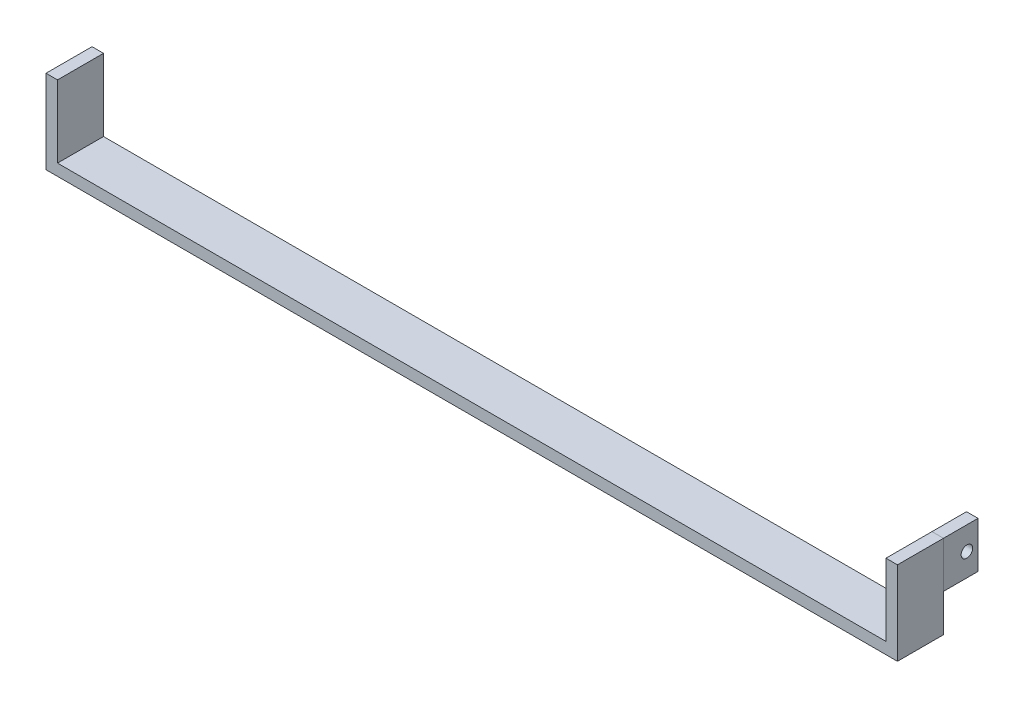
ISO-10303-21;
HEADER;
FILE_DESCRIPTION(('STEP AP214'),'2;1');
FILE_NAME('part.step','',(''),(''),'','','');
FILE_SCHEMA(('AUTOMOTIVE_DESIGN { 1 0 10303 214 1 1 1 1 }'));
ENDSEC;
DATA;
#1=APPLICATION_CONTEXT('core data for automotive mechanical design processes');
#2=APPLICATION_PROTOCOL_DEFINITION('international standard','automotive_design',2000,#1);
#3=PRODUCT_CONTEXT('',#1,'mechanical');
#4=PRODUCT('Part','Part','',(#3));
#5=PRODUCT_RELATED_PRODUCT_CATEGORY('part','',(#4));
#6=PRODUCT_DEFINITION_FORMATION('','',#4);
#7=PRODUCT_DEFINITION_CONTEXT('part definition',#1,'design');
#8=PRODUCT_DEFINITION('design','',#6,#7);
#9=PRODUCT_DEFINITION_SHAPE('','',#8);
#10=(LENGTH_UNIT() NAMED_UNIT(*) SI_UNIT(.MILLI.,.METRE.));
#11=(NAMED_UNIT(*) PLANE_ANGLE_UNIT() SI_UNIT($,.RADIAN.));
#12=(NAMED_UNIT(*) SI_UNIT($,.STERADIAN.) SOLID_ANGLE_UNIT());
#13=UNCERTAINTY_MEASURE_WITH_UNIT(LENGTH_MEASURE(1.E-05),#10,'distance_accuracy_value','');
#14=(GEOMETRIC_REPRESENTATION_CONTEXT(3) GLOBAL_UNCERTAINTY_ASSIGNED_CONTEXT((#13)) GLOBAL_UNIT_ASSIGNED_CONTEXT((#10,
#11,#12)) REPRESENTATION_CONTEXT('',''));
#15=CARTESIAN_POINT('',(0.,0.,0.));
#16=DIRECTION('',(0.,0.,1.));
#17=DIRECTION('',(1.,0.,0.));
#18=AXIS2_PLACEMENT_3D('',#15,#16,#17);
#19=CARTESIAN_POINT('',(370.,36.32,-35.));
#20=DIRECTION('',(-1.,0.,0.));
#21=DIRECTION('',(0.,0.,1.));
#22=AXIS2_PLACEMENT_3D('',#19,#20,#21);
#23=PLANE('',#22);
#24=CARTESIAN_POINT('',(370.,26.24,-30.17));
#25=DIRECTION('',(1.,0.,0.));
#26=DIRECTION('',(0.,0.,-1.));
#27=AXIS2_PLACEMENT_3D('',#24,#25,#26);
#28=CIRCLE('',#27,2.49999999999999);
#29=CARTESIAN_POINT('',(370.,26.24,-32.67));
#30=VERTEX_POINT('',#29);
#31=EDGE_CURVE('E127',#30,#30,#28,.T.);
#32=ORIENTED_EDGE('',*,*,#31,.F.);
#33=EDGE_LOOP('',(#32));
#34=FACE_BOUND('',#33,.T.);
#35=DIRECTION('',(0.,-1.,0.));
#36=VECTOR('',#35,1.);
#37=CARTESIAN_POINT('',(370.,36.32,-20.));
#38=LINE('',#37,#36);
#39=CARTESIAN_POINT('',(370.,36.32,-20.));
#40=VERTEX_POINT('',#39);
#41=CARTESIAN_POINT('',(370.,16.32,-20.));
#42=VERTEX_POINT('',#41);
#43=EDGE_CURVE('E114',#40,#42,#38,.T.);
#44=ORIENTED_EDGE('',*,*,#43,.T.);
#45=DIRECTION('',(0.,0.,1.));
#46=VECTOR('',#45,1.);
#47=CARTESIAN_POINT('',(370.,16.32,-35.));
#48=LINE('',#47,#46);
#49=CARTESIAN_POINT('',(370.,16.32,-35.));
#50=VERTEX_POINT('',#49);
#51=EDGE_CURVE('E12',#50,#42,#48,.T.);
#52=ORIENTED_EDGE('',*,*,#51,.F.);
#53=DIRECTION('',(0.,-1.,0.));
#54=VECTOR('',#53,1.);
#55=CARTESIAN_POINT('',(370.,36.32,-35.));
#56=LINE('',#55,#54);
#57=CARTESIAN_POINT('',(370.,36.32,-35.));
#58=VERTEX_POINT('',#57);
#59=EDGE_CURVE('E101',#58,#50,#56,.T.);
#60=ORIENTED_EDGE('',*,*,#59,.F.);
#61=DIRECTION('',(0.,0.,1.));
#62=VECTOR('',#61,1.);
#63=CARTESIAN_POINT('',(370.,36.32,-35.));
#64=LINE('',#63,#62);
#65=EDGE_CURVE('E110',#58,#40,#64,.T.);
#66=ORIENTED_EDGE('',*,*,#65,.T.);
#67=EDGE_LOOP('',(#44,#52,#60,#66));
#68=FACE_BOUND('',#67,.T.);
#69=ADVANCED_FACE('F49',(#34,#68),#23,.F.);
#70=CARTESIAN_POINT('',(370.,16.32,-35.));
#71=DIRECTION('',(0.,1.,0.));
#72=DIRECTION('',(0.,0.,1.));
#73=AXIS2_PLACEMENT_3D('',#70,#71,#72);
#74=PLANE('',#73);
#75=DIRECTION('',(-1.,0.,0.));
#76=VECTOR('',#75,1.);
#77=CARTESIAN_POINT('',(370.,16.32,-20.));
#78=LINE('',#77,#76);
#79=CARTESIAN_POINT('',(365.,16.32,-20.));
#80=VERTEX_POINT('',#79);
#81=EDGE_CURVE('E105',#42,#80,#78,.T.);
#82=ORIENTED_EDGE('',*,*,#81,.T.);
#83=DIRECTION('',(0.,0.,1.));
#84=VECTOR('',#83,1.);
#85=CARTESIAN_POINT('',(365.,16.32,-35.));
#86=LINE('',#85,#84);
#87=CARTESIAN_POINT('',(365.,16.32,-35.));
#88=VERTEX_POINT('',#87);
#89=EDGE_CURVE('E58',#88,#80,#86,.T.);
#90=ORIENTED_EDGE('',*,*,#89,.F.);
#91=DIRECTION('',(-1.,0.,0.));
#92=VECTOR('',#91,1.);
#93=CARTESIAN_POINT('',(370.,16.32,-35.));
#94=LINE('',#93,#92);
#95=EDGE_CURVE('E96',#50,#88,#94,.T.);
#96=ORIENTED_EDGE('',*,*,#95,.F.);
#97=ORIENTED_EDGE('',*,*,#51,.T.);
#98=EDGE_LOOP('',(#82,#90,#96,#97));
#99=FACE_BOUND('',#98,.T.);
#100=ADVANCED_FACE('F104',(#99),#74,.F.);
#101=CARTESIAN_POINT('',(365.,36.32,-35.));
#102=DIRECTION('',(1.,0.,0.));
#103=DIRECTION('',(0.,0.,-1.));
#104=AXIS2_PLACEMENT_3D('',#101,#102,#103);
#105=PLANE('',#104);
#106=CARTESIAN_POINT('',(365.,26.24,-30.17));
#107=DIRECTION('',(1.,0.,0.));
#108=DIRECTION('',(0.,0.,-1.));
#109=AXIS2_PLACEMENT_3D('',#106,#107,#108);
#110=CIRCLE('',#109,2.49999999999999);
#111=CARTESIAN_POINT('',(365.,26.24,-32.67));
#112=VERTEX_POINT('',#111);
#113=EDGE_CURVE('E52',#112,#112,#110,.T.);
#114=ORIENTED_EDGE('',*,*,#113,.T.);
#115=EDGE_LOOP('',(#114));
#116=FACE_BOUND('',#115,.T.);
#117=DIRECTION('',(0.,1.,0.));
#118=VECTOR('',#117,1.);
#119=CARTESIAN_POINT('',(365.,36.32,-20.));
#120=LINE('',#119,#118);
#121=CARTESIAN_POINT('',(365.,36.32,-20.));
#122=VERTEX_POINT('',#121);
#123=EDGE_CURVE('E83',#80,#122,#120,.T.);
#124=ORIENTED_EDGE('',*,*,#123,.T.);
#125=DIRECTION('',(0.,0.,1.));
#126=VECTOR('',#125,1.);
#127=CARTESIAN_POINT('',(365.,36.32,-35.));
#128=LINE('',#127,#126);
#129=CARTESIAN_POINT('',(365.,36.32,-35.));
#130=VERTEX_POINT('',#129);
#131=EDGE_CURVE('E106',#130,#122,#128,.T.);
#132=ORIENTED_EDGE('',*,*,#131,.F.);
#133=DIRECTION('',(0.,1.,0.));
#134=VECTOR('',#133,1.);
#135=CARTESIAN_POINT('',(365.,36.32,-35.));
#136=LINE('',#135,#134);
#137=EDGE_CURVE('E99',#88,#130,#136,.T.);
#138=ORIENTED_EDGE('',*,*,#137,.F.);
#139=ORIENTED_EDGE('',*,*,#89,.T.);
#140=EDGE_LOOP('',(#124,#132,#138,#139));
#141=FACE_BOUND('',#140,.T.);
#142=ADVANCED_FACE('F108',(#116,#141),#105,.F.);
#143=CARTESIAN_POINT('',(370.,36.32,-35.));
#144=DIRECTION('',(0.,-1.,0.));
#145=DIRECTION('',(0.,0.,-1.));
#146=AXIS2_PLACEMENT_3D('',#143,#144,#145);
#147=PLANE('',#146);
#148=DIRECTION('',(1.,0.,0.));
#149=VECTOR('',#148,1.);
#150=CARTESIAN_POINT('',(370.,36.32,-20.));
#151=LINE('',#150,#149);
#152=EDGE_CURVE('E89',#122,#40,#151,.T.);
#153=ORIENTED_EDGE('',*,*,#152,.T.);
#154=ORIENTED_EDGE('',*,*,#65,.F.);
#155=DIRECTION('',(1.,0.,0.));
#156=VECTOR('',#155,1.);
#157=CARTESIAN_POINT('',(370.,36.32,-35.));
#158=LINE('',#157,#156);
#159=EDGE_CURVE('E66',#130,#58,#158,.T.);
#160=ORIENTED_EDGE('',*,*,#159,.F.);
#161=ORIENTED_EDGE('',*,*,#131,.T.);
#162=EDGE_LOOP('',(#153,#154,#160,#161));
#163=FACE_BOUND('',#162,.T.);
#164=ADVANCED_FACE('F121',(#163),#147,.F.);
#165=CARTESIAN_POINT('',(0.,0.,-35.));
#166=DIRECTION('',(0.,0.,-1.));
#167=DIRECTION('',(-1.,0.,0.));
#168=AXIS2_PLACEMENT_3D('',#165,#166,#167);
#169=PLANE('',#168);
#170=ORIENTED_EDGE('',*,*,#59,.T.);
#171=ORIENTED_EDGE('',*,*,#95,.T.);
#172=ORIENTED_EDGE('',*,*,#137,.T.);
#173=ORIENTED_EDGE('',*,*,#159,.T.);
#174=EDGE_LOOP('',(#170,#171,#172,#173));
#175=FACE_BOUND('',#174,.T.);
#176=ADVANCED_FACE('F97',(#175),#169,.T.);
#177=CARTESIAN_POINT('',(0.,0.,-20.));
#178=DIRECTION('',(0.,0.,-1.));
#179=DIRECTION('',(-1.,0.,0.));
#180=AXIS2_PLACEMENT_3D('',#177,#178,#179);
#181=PLANE('',#180);
#182=ORIENTED_EDGE('',*,*,#43,.F.);
#183=ORIENTED_EDGE('',*,*,#152,.F.);
#184=ORIENTED_EDGE('',*,*,#123,.F.);
#185=ORIENTED_EDGE('',*,*,#81,.F.);
#186=EDGE_LOOP('',(#182,#183,#184,#185));
#187=FACE_BOUND('',#186,.T.);
#188=ADVANCED_FACE('F124',(#187),#181,.F.);
#189=CARTESIAN_POINT('',(355.,26.24,-30.17));
#190=DIRECTION('',(1.,0.,0.));
#191=DIRECTION('',(0.,0.,-1.));
#192=AXIS2_PLACEMENT_3D('',#189,#190,#191);
#193=CYLINDRICAL_SURFACE('',#192,2.49999999999999);
#194=ORIENTED_EDGE('',*,*,#31,.T.);
#195=EDGE_LOOP('',(#194));
#196=FACE_BOUND('',#195,.T.);
#197=ORIENTED_EDGE('',*,*,#113,.F.);
#198=EDGE_LOOP('',(#197));
#199=FACE_BOUND('',#198,.T.);
#200=ADVANCED_FACE('F135',(#196,#199),#193,.F.);
#201=CLOSED_SHELL('',(#69,#100,#142,#164,#176,#188,#200));
#202=MANIFOLD_SOLID_BREP('B2',#201);
#203=CARTESIAN_POINT('',(0.,5.,0.));
#204=DIRECTION('',(0.,-1.,0.));
#205=DIRECTION('',(0.,0.,-1.));
#206=AXIS2_PLACEMENT_3D('',#203,#204,#205);
#207=PLANE('',#206);
#208=DIRECTION('',(0.,0.,1.));
#209=VECTOR('',#208,1.);
#210=CARTESIAN_POINT('',(365.,5.,-20.));
#211=LINE('',#210,#209);
#212=CARTESIAN_POINT('',(365.,5.,-20.));
#213=VERTEX_POINT('',#212);
#214=CARTESIAN_POINT('',(365.,5.,0.));
#215=VERTEX_POINT('',#214);
#216=EDGE_CURVE('E276',#213,#215,#211,.T.);
#217=ORIENTED_EDGE('',*,*,#216,.F.);
#218=DIRECTION('',(-1.,0.,0.));
#219=VECTOR('',#218,1.);
#220=CARTESIAN_POINT('',(0.,5.,-20.));
#221=LINE('',#220,#219);
#222=CARTESIAN_POINT('',(5.,5.,-20.));
#223=VERTEX_POINT('',#222);
#224=EDGE_CURVE('E303',#213,#223,#221,.T.);
#225=ORIENTED_EDGE('',*,*,#224,.T.);
#226=DIRECTION('',(0.,0.,-1.));
#227=VECTOR('',#226,1.);
#228=CARTESIAN_POINT('',(5.,5.,-20.));
#229=LINE('',#228,#227);
#230=CARTESIAN_POINT('',(5.,5.,0.));
#231=VERTEX_POINT('',#230);
#232=EDGE_CURVE('E213',#231,#223,#229,.T.);
#233=ORIENTED_EDGE('',*,*,#232,.F.);
#234=DIRECTION('',(1.,0.,0.));
#235=VECTOR('',#234,1.);
#236=CARTESIAN_POINT('',(0.,5.,0.));
#237=LINE('',#236,#235);
#238=EDGE_CURVE('E208',#231,#215,#237,.T.);
#239=ORIENTED_EDGE('',*,*,#238,.T.);
#240=EDGE_LOOP('',(#217,#225,#233,#239));
#241=FACE_BOUND('',#240,.T.);
#242=ADVANCED_FACE('F193',(#241),#207,.F.);
#243=CARTESIAN_POINT('',(0.,5.,0.));
#244=DIRECTION('',(1.,0.,0.));
#245=DIRECTION('',(0.,0.,-1.));
#246=AXIS2_PLACEMENT_3D('',#243,#244,#245);
#247=PLANE('',#246);
#248=DIRECTION('',(0.,0.,1.));
#249=VECTOR('',#248,1.);
#250=CARTESIAN_POINT('',(0.,0.,0.));
#251=LINE('',#250,#249);
#252=CARTESIAN_POINT('',(0.,0.,-20.));
#253=VERTEX_POINT('',#252);
#254=CARTESIAN_POINT('',(0.,0.,0.));
#255=VERTEX_POINT('',#254);
#256=EDGE_CURVE('E301',#253,#255,#251,.T.);
#257=ORIENTED_EDGE('',*,*,#256,.T.);
#258=DIRECTION('',(0.,-1.,0.));
#259=VECTOR('',#258,1.);
#260=CARTESIAN_POINT('',(0.,5.,0.));
#261=LINE('',#260,#259);
#262=CARTESIAN_POINT('',(0.,36.32,0.));
#263=VERTEX_POINT('',#262);
#264=EDGE_CURVE('E47',#263,#255,#261,.T.);
#265=ORIENTED_EDGE('',*,*,#264,.F.);
#266=DIRECTION('',(0.,0.,1.));
#267=VECTOR('',#266,1.);
#268=CARTESIAN_POINT('',(0.,36.32,-20.));
#269=LINE('',#268,#267);
#270=CARTESIAN_POINT('',(0.,36.32,-20.));
#271=VERTEX_POINT('',#270);
#272=EDGE_CURVE('E281',#271,#263,#269,.T.);
#273=ORIENTED_EDGE('',*,*,#272,.F.);
#274=DIRECTION('',(0.,-1.,0.));
#275=VECTOR('',#274,1.);
#276=CARTESIAN_POINT('',(0.,5.,-20.));
#277=LINE('',#276,#275);
#278=EDGE_CURVE('E306',#271,#253,#277,.T.);
#279=ORIENTED_EDGE('',*,*,#278,.T.);
#280=EDGE_LOOP('',(#257,#265,#273,#279));
#281=FACE_BOUND('',#280,.T.);
#282=ADVANCED_FACE('F195',(#281),#247,.F.);
#283=CARTESIAN_POINT('',(0.,5.,0.));
#284=DIRECTION('',(0.,0.,-1.));
#285=DIRECTION('',(-1.,0.,0.));
#286=AXIS2_PLACEMENT_3D('',#283,#284,#285);
#287=PLANE('',#286);
#288=DIRECTION('',(1.,0.,0.));
#289=VECTOR('',#288,1.);
#290=CARTESIAN_POINT('',(0.,0.,0.));
#291=LINE('',#290,#289);
#292=CARTESIAN_POINT('',(370.,0.,0.));
#293=VERTEX_POINT('',#292);
#294=EDGE_CURVE('E309',#255,#293,#291,.T.);
#295=ORIENTED_EDGE('',*,*,#294,.T.);
#296=DIRECTION('',(0.,-1.,0.));
#297=VECTOR('',#296,1.);
#298=CARTESIAN_POINT('',(370.,5.,0.));
#299=LINE('',#298,#297);
#300=CARTESIAN_POINT('',(370.,36.32,0.));
#301=VERTEX_POINT('',#300);
#302=EDGE_CURVE('E201',#301,#293,#299,.T.);
#303=ORIENTED_EDGE('',*,*,#302,.F.);
#304=DIRECTION('',(1.,0.,0.));
#305=VECTOR('',#304,1.);
#306=CARTESIAN_POINT('',(365.,36.32,0.));
#307=LINE('',#306,#305);
#308=CARTESIAN_POINT('',(365.,36.32,0.));
#309=VERTEX_POINT('',#308);
#310=EDGE_CURVE('E256',#309,#301,#307,.T.);
#311=ORIENTED_EDGE('',*,*,#310,.F.);
#312=DIRECTION('',(0.,-1.,0.));
#313=VECTOR('',#312,1.);
#314=CARTESIAN_POINT('',(365.,36.32,0.));
#315=LINE('',#314,#313);
#316=EDGE_CURVE('E260',#309,#215,#315,.T.);
#317=ORIENTED_EDGE('',*,*,#316,.T.);
#318=ORIENTED_EDGE('',*,*,#238,.F.);
#319=DIRECTION('',(0.,-1.,0.));
#320=VECTOR('',#319,1.);
#321=CARTESIAN_POINT('',(5.,36.32,0.));
#322=LINE('',#321,#320);
#323=CARTESIAN_POINT('',(5.,36.32,0.));
#324=VERTEX_POINT('',#323);
#325=EDGE_CURVE('E298',#324,#231,#322,.T.);
#326=ORIENTED_EDGE('',*,*,#325,.F.);
#327=DIRECTION('',(1.,0.,0.));
#328=VECTOR('',#327,1.);
#329=CARTESIAN_POINT('',(0.,36.32,0.));
#330=LINE('',#329,#328);
#331=EDGE_CURVE('E288',#263,#324,#330,.T.);
#332=ORIENTED_EDGE('',*,*,#331,.F.);
#333=ORIENTED_EDGE('',*,*,#264,.T.);
#334=EDGE_LOOP('',(#295,#303,#311,#317,#318,#326,#332,#333));
#335=FACE_BOUND('',#334,.T.);
#336=ADVANCED_FACE('F258',(#335),#287,.F.);
#337=CARTESIAN_POINT('',(370.,5.,0.));
#338=DIRECTION('',(-1.,0.,0.));
#339=DIRECTION('',(0.,0.,1.));
#340=AXIS2_PLACEMENT_3D('',#337,#338,#339);
#341=PLANE('',#340);
#342=DIRECTION('',(0.,0.,-1.));
#343=VECTOR('',#342,1.);
#344=CARTESIAN_POINT('',(370.,0.,0.));
#345=LINE('',#344,#343);
#346=CARTESIAN_POINT('',(370.,0.,-20.));
#347=VERTEX_POINT('',#346);
#348=EDGE_CURVE('E311',#293,#347,#345,.T.);
#349=ORIENTED_EDGE('',*,*,#348,.T.);
#350=DIRECTION('',(0.,-1.,0.));
#351=VECTOR('',#350,1.);
#352=CARTESIAN_POINT('',(370.,5.,-20.));
#353=LINE('',#352,#351);
#354=CARTESIAN_POINT('',(370.,36.32,-20.));
#355=VERTEX_POINT('',#354);
#356=EDGE_CURVE('E316',#355,#347,#353,.T.);
#357=ORIENTED_EDGE('',*,*,#356,.F.);
#358=DIRECTION('',(0.,0.,-1.));
#359=VECTOR('',#358,1.);
#360=CARTESIAN_POINT('',(370.,36.32,-20.));
#361=LINE('',#360,#359);
#362=EDGE_CURVE('E266',#301,#355,#361,.T.);
#363=ORIENTED_EDGE('',*,*,#362,.F.);
#364=ORIENTED_EDGE('',*,*,#302,.T.);
#365=EDGE_LOOP('',(#349,#357,#363,#364));
#366=FACE_BOUND('',#365,.T.);
#367=ADVANCED_FACE('F320',(#366),#341,.F.);
#368=CARTESIAN_POINT('',(0.,5.,-20.));
#369=DIRECTION('',(0.,0.,1.));
#370=DIRECTION('',(1.,0.,0.));
#371=AXIS2_PLACEMENT_3D('',#368,#369,#370);
#372=PLANE('',#371);
#373=DIRECTION('',(-1.,0.,0.));
#374=VECTOR('',#373,1.);
#375=CARTESIAN_POINT('',(0.,0.,-20.));
#376=LINE('',#375,#374);
#377=EDGE_CURVE('E304',#347,#253,#376,.T.);
#378=ORIENTED_EDGE('',*,*,#377,.T.);
#379=ORIENTED_EDGE('',*,*,#278,.F.);
#380=DIRECTION('',(-1.,0.,0.));
#381=VECTOR('',#380,1.);
#382=CARTESIAN_POINT('',(0.,36.32,-20.));
#383=LINE('',#382,#381);
#384=CARTESIAN_POINT('',(5.,36.32,-20.));
#385=VERTEX_POINT('',#384);
#386=EDGE_CURVE('E292',#385,#271,#383,.T.);
#387=ORIENTED_EDGE('',*,*,#386,.F.);
#388=DIRECTION('',(0.,-1.,0.));
#389=VECTOR('',#388,1.);
#390=CARTESIAN_POINT('',(5.,36.32,-20.));
#391=LINE('',#390,#389);
#392=EDGE_CURVE('E294',#385,#223,#391,.T.);
#393=ORIENTED_EDGE('',*,*,#392,.T.);
#394=ORIENTED_EDGE('',*,*,#224,.F.);
#395=DIRECTION('',(0.,-1.,0.));
#396=VECTOR('',#395,1.);
#397=CARTESIAN_POINT('',(365.,36.32,-20.));
#398=LINE('',#397,#396);
#399=CARTESIAN_POINT('',(365.,36.32,-20.));
#400=VERTEX_POINT('',#399);
#401=EDGE_CURVE('E279',#400,#213,#398,.T.);
#402=ORIENTED_EDGE('',*,*,#401,.F.);
#403=DIRECTION('',(-1.,0.,0.));
#404=VECTOR('',#403,1.);
#405=CARTESIAN_POINT('',(365.,36.32,-20.));
#406=LINE('',#405,#404);
#407=EDGE_CURVE('E272',#355,#400,#406,.T.);
#408=ORIENTED_EDGE('',*,*,#407,.F.);
#409=ORIENTED_EDGE('',*,*,#356,.T.);
#410=EDGE_LOOP('',(#378,#379,#387,#393,#394,#402,#408,#409));
#411=FACE_BOUND('',#410,.T.);
#412=ADVANCED_FACE('F326',(#411),#372,.F.);
#413=CARTESIAN_POINT('',(0.,0.,0.));
#414=DIRECTION('',(0.,-1.,0.));
#415=DIRECTION('',(0.,0.,-1.));
#416=AXIS2_PLACEMENT_3D('',#413,#414,#415);
#417=PLANE('',#416);
#418=ORIENTED_EDGE('',*,*,#256,.F.);
#419=ORIENTED_EDGE('',*,*,#377,.F.);
#420=ORIENTED_EDGE('',*,*,#348,.F.);
#421=ORIENTED_EDGE('',*,*,#294,.F.);
#422=EDGE_LOOP('',(#418,#419,#420,#421));
#423=FACE_BOUND('',#422,.T.);
#424=ADVANCED_FACE('F324',(#423),#417,.T.);
#425=CARTESIAN_POINT('',(5.,36.32,-20.));
#426=DIRECTION('',(-1.,0.,0.));
#427=DIRECTION('',(0.,0.,1.));
#428=AXIS2_PLACEMENT_3D('',#425,#426,#427);
#429=PLANE('',#428);
#430=ORIENTED_EDGE('',*,*,#232,.T.);
#431=ORIENTED_EDGE('',*,*,#392,.F.);
#432=DIRECTION('',(0.,0.,-1.));
#433=VECTOR('',#432,1.);
#434=CARTESIAN_POINT('',(5.,36.32,-20.));
#435=LINE('',#434,#433);
#436=EDGE_CURVE('E290',#324,#385,#435,.T.);
#437=ORIENTED_EDGE('',*,*,#436,.F.);
#438=ORIENTED_EDGE('',*,*,#325,.T.);
#439=EDGE_LOOP('',(#430,#431,#437,#438));
#440=FACE_BOUND('',#439,.T.);
#441=ADVANCED_FACE('F337',(#440),#429,.F.);
#442=CARTESIAN_POINT('',(0.,36.32,0.));
#443=DIRECTION('',(0.,1.,0.));
#444=DIRECTION('',(0.,0.,1.));
#445=AXIS2_PLACEMENT_3D('',#442,#443,#444);
#446=PLANE('',#445);
#447=ORIENTED_EDGE('',*,*,#272,.T.);
#448=ORIENTED_EDGE('',*,*,#331,.T.);
#449=ORIENTED_EDGE('',*,*,#436,.T.);
#450=ORIENTED_EDGE('',*,*,#386,.T.);
#451=EDGE_LOOP('',(#447,#448,#449,#450));
#452=FACE_BOUND('',#451,.T.);
#453=ADVANCED_FACE('F332',(#452),#446,.T.);
#454=CARTESIAN_POINT('',(365.,36.32,-20.));
#455=DIRECTION('',(1.,0.,0.));
#456=DIRECTION('',(0.,0.,-1.));
#457=AXIS2_PLACEMENT_3D('',#454,#455,#456);
#458=PLANE('',#457);
#459=ORIENTED_EDGE('',*,*,#216,.T.);
#460=ORIENTED_EDGE('',*,*,#316,.F.);
#461=DIRECTION('',(0.,0.,1.));
#462=VECTOR('',#461,1.);
#463=CARTESIAN_POINT('',(365.,36.32,-20.));
#464=LINE('',#463,#462);
#465=EDGE_CURVE('E267',#400,#309,#464,.T.);
#466=ORIENTED_EDGE('',*,*,#465,.F.);
#467=ORIENTED_EDGE('',*,*,#401,.T.);
#468=EDGE_LOOP('',(#459,#460,#466,#467));
#469=FACE_BOUND('',#468,.T.);
#470=ADVANCED_FACE('F278',(#469),#458,.F.);
#471=CARTESIAN_POINT('',(0.,36.32,0.));
#472=DIRECTION('',(0.,1.,0.));
#473=DIRECTION('',(0.,0.,1.));
#474=AXIS2_PLACEMENT_3D('',#471,#472,#473);
#475=PLANE('',#474);
#476=ORIENTED_EDGE('',*,*,#465,.T.);
#477=ORIENTED_EDGE('',*,*,#310,.T.);
#478=ORIENTED_EDGE('',*,*,#362,.T.);
#479=ORIENTED_EDGE('',*,*,#407,.T.);
#480=EDGE_LOOP('',(#476,#477,#478,#479));
#481=FACE_BOUND('',#480,.T.);
#482=ADVANCED_FACE('F270',(#481),#475,.T.);
#483=CLOSED_SHELL('',(#242,#282,#336,#367,#412,#424,#441,#453,#470,#482));
#484=MANIFOLD_SOLID_BREP('B6',#483);
#485=ADVANCED_BREP_SHAPE_REPRESENTATION('',(#18,#202,#484),#14);
#486=SHAPE_DEFINITION_REPRESENTATION(#9,#485);
ENDSEC;
END-ISO-10303-21;
